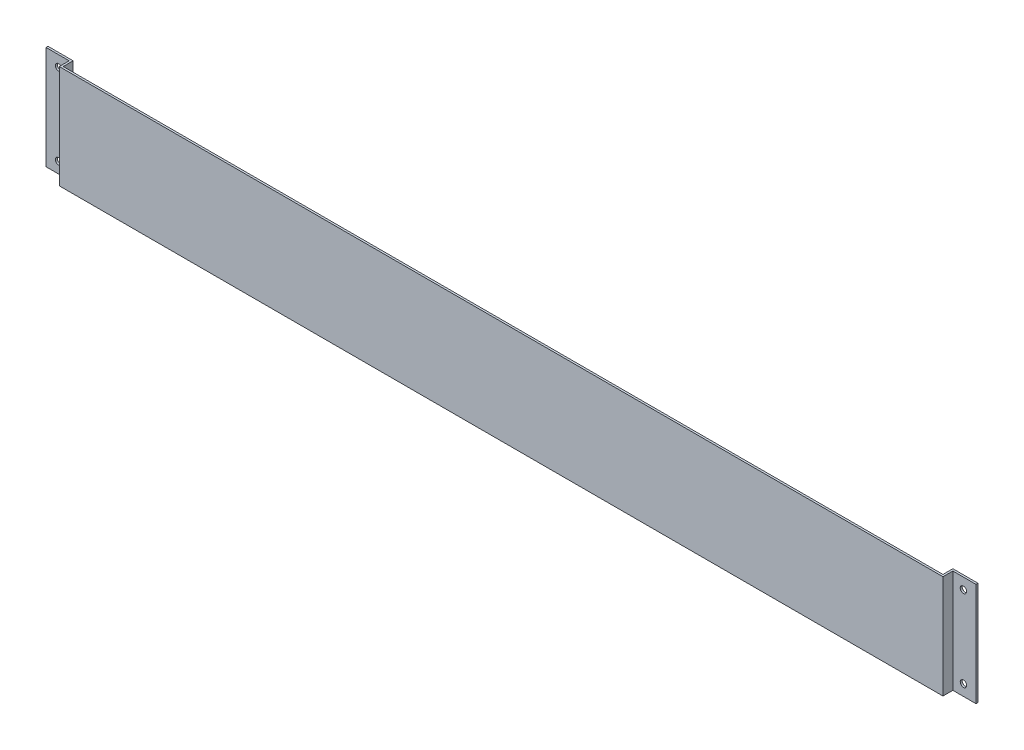
ISO-10303-21;
HEADER;
FILE_DESCRIPTION(('STEP AP214'),'2;1');
FILE_NAME('part.step','',(''),(''),'','','');
FILE_SCHEMA(('AUTOMOTIVE_DESIGN { 1 0 10303 214 1 1 1 1 }'));
ENDSEC;
DATA;
#1=APPLICATION_CONTEXT('core data for automotive mechanical design processes');
#2=APPLICATION_PROTOCOL_DEFINITION('international standard','automotive_design',2000,#1);
#3=PRODUCT_CONTEXT('',#1,'mechanical');
#4=PRODUCT('Part','Part','',(#3));
#5=PRODUCT_RELATED_PRODUCT_CATEGORY('part','',(#4));
#6=PRODUCT_DEFINITION_FORMATION('','',#4);
#7=PRODUCT_DEFINITION_CONTEXT('part definition',#1,'design');
#8=PRODUCT_DEFINITION('design','',#6,#7);
#9=PRODUCT_DEFINITION_SHAPE('','',#8);
#10=(LENGTH_UNIT() NAMED_UNIT(*) SI_UNIT(.MILLI.,.METRE.));
#11=(NAMED_UNIT(*) PLANE_ANGLE_UNIT() SI_UNIT($,.RADIAN.));
#12=(NAMED_UNIT(*) SI_UNIT($,.STERADIAN.) SOLID_ANGLE_UNIT());
#13=UNCERTAINTY_MEASURE_WITH_UNIT(LENGTH_MEASURE(1.E-05),#10,'distance_accuracy_value','');
#14=(GEOMETRIC_REPRESENTATION_CONTEXT(3) GLOBAL_UNCERTAINTY_ASSIGNED_CONTEXT((#13)) GLOBAL_UNIT_ASSIGNED_CONTEXT((#10,
#11,#12)) REPRESENTATION_CONTEXT('',''));
#15=CARTESIAN_POINT('',(0.,0.,0.));
#16=DIRECTION('',(0.,0.,1.));
#17=DIRECTION('',(1.,0.,0.));
#18=AXIS2_PLACEMENT_3D('',#15,#16,#17);
#19=CARTESIAN_POINT('',(914.4,104.45,-42.4689560617034));
#20=DIRECTION('',(0.,0.,1.));
#21=DIRECTION('',(1.,0.,0.));
#22=AXIS2_PLACEMENT_3D('',#19,#20,#21);
#23=PLANE('',#22);
#24=CARTESIAN_POINT('',(927.1,93.34,-42.4689560617034));
#25=DIRECTION('',(0.,0.,1.));
#26=DIRECTION('',(1.,0.,0.));
#27=AXIS2_PLACEMENT_3D('',#24,#25,#26);
#28=CIRCLE('',#27,3.24999999999995);
#29=CARTESIAN_POINT('',(930.35,93.34,-42.4689560617034));
#30=VERTEX_POINT('',#29);
#31=EDGE_CURVE('E267',#30,#30,#28,.T.);
#32=ORIENTED_EDGE('',*,*,#31,.T.);
#33=EDGE_LOOP('',(#32));
#34=FACE_BOUND('',#33,.T.);
#35=CARTESIAN_POINT('',(927.1,11.11,-42.4689560617034));
#36=DIRECTION('',(0.,0.,1.));
#37=DIRECTION('',(1.,0.,0.));
#38=AXIS2_PLACEMENT_3D('',#35,#36,#37);
#39=CIRCLE('',#38,3.24999999999995);
#40=CARTESIAN_POINT('',(930.35,11.11,-42.4689560617034));
#41=VERTEX_POINT('',#40);
#42=EDGE_CURVE('E161',#41,#41,#39,.T.);
#43=ORIENTED_EDGE('',*,*,#42,.T.);
#44=EDGE_LOOP('',(#43));
#45=FACE_BOUND('',#44,.T.);
#46=DIRECTION('',(-1.,0.,0.));
#47=VECTOR('',#46,1.);
#48=CARTESIAN_POINT('',(914.4,0.,-42.4689560617034));
#49=LINE('',#48,#47);
#50=CARTESIAN_POINT('',(939.8,0.,-42.4689560617034));
#51=VERTEX_POINT('',#50);
#52=CARTESIAN_POINT('',(914.4,0.,-42.4689560617034));
#53=VERTEX_POINT('',#52);
#54=EDGE_CURVE('E157',#51,#53,#49,.T.);
#55=ORIENTED_EDGE('',*,*,#54,.T.);
#56=DIRECTION('',(0.,-1.,0.));
#57=VECTOR('',#56,1.);
#58=CARTESIAN_POINT('',(914.4,104.45,-42.4689560617034));
#59=LINE('',#58,#57);
#60=CARTESIAN_POINT('',(914.4,104.45,-42.4689560617034));
#61=VERTEX_POINT('',#60);
#62=EDGE_CURVE('E11',#61,#53,#59,.T.);
#63=ORIENTED_EDGE('',*,*,#62,.F.);
#64=DIRECTION('',(-1.,0.,0.));
#65=VECTOR('',#64,1.);
#66=CARTESIAN_POINT('',(914.4,104.45,-42.4689560617034));
#67=LINE('',#66,#65);
#68=CARTESIAN_POINT('',(939.8,104.45,-42.4689560617034));
#69=VERTEX_POINT('',#68);
#70=EDGE_CURVE('E180',#69,#61,#67,.T.);
#71=ORIENTED_EDGE('',*,*,#70,.F.);
#72=DIRECTION('',(0.,-1.,0.));
#73=VECTOR('',#72,1.);
#74=CARTESIAN_POINT('',(939.8,104.45,-42.4689560617034));
#75=LINE('',#74,#73);
#76=EDGE_CURVE('E153',#69,#51,#75,.T.);
#77=ORIENTED_EDGE('',*,*,#76,.T.);
#78=EDGE_LOOP('',(#55,#63,#71,#77));
#79=FACE_BOUND('',#78,.T.);
#80=ADVANCED_FACE('F37',(#34,#45,#79),#23,.F.);
#81=CARTESIAN_POINT('',(914.4,104.45,-32.4689560617034));
#82=DIRECTION('',(1.,0.,0.));
#83=DIRECTION('',(0.,0.,-1.));
#84=AXIS2_PLACEMENT_3D('',#81,#82,#83);
#85=PLANE('',#84);
#86=DIRECTION('',(0.,0.,1.));
#87=VECTOR('',#86,1.);
#88=CARTESIAN_POINT('',(914.4,0.,-32.4689560617034));
#89=LINE('',#88,#87);
#90=CARTESIAN_POINT('',(914.4,0.,-32.4689560617034));
#91=VERTEX_POINT('',#90);
#92=EDGE_CURVE('E160',#53,#91,#89,.T.);
#93=ORIENTED_EDGE('',*,*,#92,.T.);
#94=DIRECTION('',(0.,-1.,0.));
#95=VECTOR('',#94,1.);
#96=CARTESIAN_POINT('',(914.4,104.45,-32.4689560617034));
#97=LINE('',#96,#95);
#98=CARTESIAN_POINT('',(914.4,104.45,-32.4689560617034));
#99=VERTEX_POINT('',#98);
#100=EDGE_CURVE('E45',#99,#91,#97,.T.);
#101=ORIENTED_EDGE('',*,*,#100,.F.);
#102=DIRECTION('',(0.,0.,1.));
#103=VECTOR('',#102,1.);
#104=CARTESIAN_POINT('',(914.4,104.45,-32.4689560617034));
#105=LINE('',#104,#103);
#106=EDGE_CURVE('E108',#61,#99,#105,.T.);
#107=ORIENTED_EDGE('',*,*,#106,.F.);
#108=ORIENTED_EDGE('',*,*,#62,.T.);
#109=EDGE_LOOP('',(#93,#101,#107,#108));
#110=FACE_BOUND('',#109,.T.);
#111=ADVANCED_FACE('F259',(#110),#85,.F.);
#112=CARTESIAN_POINT('',(25.4,104.45,-32.4689560617034));
#113=DIRECTION('',(0.,0.,1.));
#114=DIRECTION('',(1.,0.,0.));
#115=AXIS2_PLACEMENT_3D('',#112,#113,#114);
#116=PLANE('',#115);
#117=DIRECTION('',(-1.,0.,0.));
#118=VECTOR('',#117,1.);
#119=CARTESIAN_POINT('',(25.4,0.,-32.4689560617034));
#120=LINE('',#119,#118);
#121=CARTESIAN_POINT('',(25.4,0.,-32.4689560617034));
#122=VERTEX_POINT('',#121);
#123=EDGE_CURVE('E163',#91,#122,#120,.T.);
#124=ORIENTED_EDGE('',*,*,#123,.T.);
#125=DIRECTION('',(0.,-1.,0.));
#126=VECTOR('',#125,1.);
#127=CARTESIAN_POINT('',(25.4,104.45,-32.4689560617034));
#128=LINE('',#127,#126);
#129=CARTESIAN_POINT('',(25.4,104.45,-32.4689560617034));
#130=VERTEX_POINT('',#129);
#131=EDGE_CURVE('E199',#130,#122,#128,.T.);
#132=ORIENTED_EDGE('',*,*,#131,.F.);
#133=DIRECTION('',(-1.,0.,0.));
#134=VECTOR('',#133,1.);
#135=CARTESIAN_POINT('',(25.4,104.45,-32.4689560617034));
#136=LINE('',#135,#134);
#137=EDGE_CURVE('E207',#99,#130,#136,.T.);
#138=ORIENTED_EDGE('',*,*,#137,.F.);
#139=ORIENTED_EDGE('',*,*,#100,.T.);
#140=EDGE_LOOP('',(#124,#132,#138,#139));
#141=FACE_BOUND('',#140,.T.);
#142=ADVANCED_FACE('F205',(#141),#116,.F.);
#143=CARTESIAN_POINT('',(25.4,104.45,-42.4689560617034));
#144=DIRECTION('',(-1.,0.,0.));
#145=DIRECTION('',(0.,0.,1.));
#146=AXIS2_PLACEMENT_3D('',#143,#144,#145);
#147=PLANE('',#146);
#148=DIRECTION('',(0.,0.,-1.));
#149=VECTOR('',#148,1.);
#150=CARTESIAN_POINT('',(25.4,0.,-42.4689560617034));
#151=LINE('',#150,#149);
#152=CARTESIAN_POINT('',(25.4,0.,-42.4689560617034));
#153=VERTEX_POINT('',#152);
#154=EDGE_CURVE('E165',#122,#153,#151,.T.);
#155=ORIENTED_EDGE('',*,*,#154,.T.);
#156=DIRECTION('',(0.,-1.,0.));
#157=VECTOR('',#156,1.);
#158=CARTESIAN_POINT('',(25.4,104.45,-42.4689560617034));
#159=LINE('',#158,#157);
#160=CARTESIAN_POINT('',(25.4,104.45,-42.4689560617034));
#161=VERTEX_POINT('',#160);
#162=EDGE_CURVE('E196',#161,#153,#159,.T.);
#163=ORIENTED_EDGE('',*,*,#162,.F.);
#164=DIRECTION('',(0.,0.,-1.));
#165=VECTOR('',#164,1.);
#166=CARTESIAN_POINT('',(25.4,104.45,-42.4689560617034));
#167=LINE('',#166,#165);
#168=EDGE_CURVE('E225',#130,#161,#167,.T.);
#169=ORIENTED_EDGE('',*,*,#168,.F.);
#170=ORIENTED_EDGE('',*,*,#131,.T.);
#171=EDGE_LOOP('',(#155,#163,#169,#170));
#172=FACE_BOUND('',#171,.T.);
#173=ADVANCED_FACE('F216',(#172),#147,.F.);
#174=CARTESIAN_POINT('',(0.,104.45,-42.4689560617034));
#175=DIRECTION('',(0.,0.,1.));
#176=DIRECTION('',(1.,0.,0.));
#177=AXIS2_PLACEMENT_3D('',#174,#175,#176);
#178=PLANE('',#177);
#179=CARTESIAN_POINT('',(12.7,11.11,-42.4689560617034));
#180=DIRECTION('',(0.,0.,1.));
#181=DIRECTION('',(1.,0.,0.));
#182=AXIS2_PLACEMENT_3D('',#179,#180,#181);
#183=CIRCLE('',#182,3.25);
#184=CARTESIAN_POINT('',(15.95,11.11,-42.4689560617034));
#185=VERTEX_POINT('',#184);
#186=EDGE_CURVE('E281',#185,#185,#183,.T.);
#187=ORIENTED_EDGE('',*,*,#186,.T.);
#188=EDGE_LOOP('',(#187));
#189=FACE_BOUND('',#188,.T.);
#190=CARTESIAN_POINT('',(12.7,93.34,-42.4689560617034));
#191=DIRECTION('',(0.,0.,1.));
#192=DIRECTION('',(1.,0.,0.));
#193=AXIS2_PLACEMENT_3D('',#190,#191,#192);
#194=CIRCLE('',#193,3.25);
#195=CARTESIAN_POINT('',(15.95,93.34,-42.4689560617034));
#196=VERTEX_POINT('',#195);
#197=EDGE_CURVE('E282',#196,#196,#194,.T.);
#198=ORIENTED_EDGE('',*,*,#197,.T.);
#199=EDGE_LOOP('',(#198));
#200=FACE_BOUND('',#199,.T.);
#201=DIRECTION('',(-1.,0.,0.));
#202=VECTOR('',#201,1.);
#203=CARTESIAN_POINT('',(0.,0.,-42.4689560617034));
#204=LINE('',#203,#202);
#205=CARTESIAN_POINT('',(0.,0.,-42.4689560617034));
#206=VERTEX_POINT('',#205);
#207=EDGE_CURVE('E167',#153,#206,#204,.T.);
#208=ORIENTED_EDGE('',*,*,#207,.T.);
#209=DIRECTION('',(0.,-1.,0.));
#210=VECTOR('',#209,1.);
#211=CARTESIAN_POINT('',(0.,104.45,-42.4689560617034));
#212=LINE('',#211,#210);
#213=CARTESIAN_POINT('',(0.,104.45,-42.4689560617034));
#214=VERTEX_POINT('',#213);
#215=EDGE_CURVE('E193',#214,#206,#212,.T.);
#216=ORIENTED_EDGE('',*,*,#215,.F.);
#217=DIRECTION('',(-1.,0.,0.));
#218=VECTOR('',#217,1.);
#219=CARTESIAN_POINT('',(0.,104.45,-42.4689560617034));
#220=LINE('',#219,#218);
#221=EDGE_CURVE('E222',#161,#214,#220,.T.);
#222=ORIENTED_EDGE('',*,*,#221,.F.);
#223=ORIENTED_EDGE('',*,*,#162,.T.);
#224=EDGE_LOOP('',(#208,#216,#222,#223));
#225=FACE_BOUND('',#224,.T.);
#226=ADVANCED_FACE('F220',(#189,#200,#225),#178,.F.);
#227=CARTESIAN_POINT('',(0.,104.45,-40.4689560617034));
#228=DIRECTION('',(1.,0.,0.));
#229=DIRECTION('',(0.,0.,-1.));
#230=AXIS2_PLACEMENT_3D('',#227,#228,#229);
#231=PLANE('',#230);
#232=DIRECTION('',(0.,0.,1.));
#233=VECTOR('',#232,1.);
#234=CARTESIAN_POINT('',(0.,0.,-40.4689560617034));
#235=LINE('',#234,#233);
#236=CARTESIAN_POINT('',(0.,0.,-40.4689560617034));
#237=VERTEX_POINT('',#236);
#238=EDGE_CURVE('E169',#206,#237,#235,.T.);
#239=ORIENTED_EDGE('',*,*,#238,.T.);
#240=DIRECTION('',(0.,-1.,0.));
#241=VECTOR('',#240,1.);
#242=CARTESIAN_POINT('',(0.,104.45,-40.4689560617034));
#243=LINE('',#242,#241);
#244=CARTESIAN_POINT('',(0.,104.45,-40.4689560617034));
#245=VERTEX_POINT('',#244);
#246=EDGE_CURVE('E190',#245,#237,#243,.T.);
#247=ORIENTED_EDGE('',*,*,#246,.F.);
#248=DIRECTION('',(0.,0.,1.));
#249=VECTOR('',#248,1.);
#250=CARTESIAN_POINT('',(0.,104.45,-40.4689560617034));
#251=LINE('',#250,#249);
#252=EDGE_CURVE('E224',#214,#245,#251,.T.);
#253=ORIENTED_EDGE('',*,*,#252,.F.);
#254=ORIENTED_EDGE('',*,*,#215,.T.);
#255=EDGE_LOOP('',(#239,#247,#253,#254));
#256=FACE_BOUND('',#255,.T.);
#257=ADVANCED_FACE('F307',(#256),#231,.F.);
#258=CARTESIAN_POINT('',(23.4,104.45,-40.4689560617034));
#259=DIRECTION('',(0.,0.,-1.));
#260=DIRECTION('',(-1.,0.,0.));
#261=AXIS2_PLACEMENT_3D('',#258,#259,#260);
#262=PLANE('',#261);
#263=CARTESIAN_POINT('',(12.7,11.11,-40.4689560617031));
#264=DIRECTION('',(0.,0.,1.));
#265=DIRECTION('',(1.,0.,0.));
#266=AXIS2_PLACEMENT_3D('',#263,#264,#265);
#267=CIRCLE('',#266,3.25);
#268=CARTESIAN_POINT('',(15.95,11.11,-40.4689560617031));
#269=VERTEX_POINT('',#268);
#270=EDGE_CURVE('E276',#269,#269,#267,.T.);
#271=ORIENTED_EDGE('',*,*,#270,.F.);
#272=EDGE_LOOP('',(#271));
#273=FACE_BOUND('',#272,.T.);
#274=CARTESIAN_POINT('',(12.7,93.34,-40.4689560617031));
#275=DIRECTION('',(0.,0.,1.));
#276=DIRECTION('',(1.,0.,0.));
#277=AXIS2_PLACEMENT_3D('',#274,#275,#276);
#278=CIRCLE('',#277,3.25);
#279=CARTESIAN_POINT('',(15.95,93.34,-40.4689560617031));
#280=VERTEX_POINT('',#279);
#281=EDGE_CURVE('E289',#280,#280,#278,.T.);
#282=ORIENTED_EDGE('',*,*,#281,.F.);
#283=EDGE_LOOP('',(#282));
#284=FACE_BOUND('',#283,.T.);
#285=DIRECTION('',(1.,0.,0.));
#286=VECTOR('',#285,1.);
#287=CARTESIAN_POINT('',(23.4,0.,-40.4689560617034));
#288=LINE('',#287,#286);
#289=CARTESIAN_POINT('',(23.4,0.,-40.4689560617034));
#290=VERTEX_POINT('',#289);
#291=EDGE_CURVE('E171',#237,#290,#288,.T.);
#292=ORIENTED_EDGE('',*,*,#291,.T.);
#293=DIRECTION('',(0.,-1.,0.));
#294=VECTOR('',#293,1.);
#295=CARTESIAN_POINT('',(23.4,104.45,-40.4689560617034));
#296=LINE('',#295,#294);
#297=CARTESIAN_POINT('',(23.4,104.45,-40.4689560617034));
#298=VERTEX_POINT('',#297);
#299=EDGE_CURVE('E187',#298,#290,#296,.T.);
#300=ORIENTED_EDGE('',*,*,#299,.F.);
#301=DIRECTION('',(1.,0.,0.));
#302=VECTOR('',#301,1.);
#303=CARTESIAN_POINT('',(23.4,104.45,-40.4689560617034));
#304=LINE('',#303,#302);
#305=EDGE_CURVE('E227',#245,#298,#304,.T.);
#306=ORIENTED_EDGE('',*,*,#305,.F.);
#307=ORIENTED_EDGE('',*,*,#246,.T.);
#308=EDGE_LOOP('',(#292,#300,#306,#307));
#309=FACE_BOUND('',#308,.T.);
#310=ADVANCED_FACE('F304',(#273,#284,#309),#262,.F.);
#311=CARTESIAN_POINT('',(23.4,104.45,-30.4689560617034));
#312=DIRECTION('',(1.,0.,0.));
#313=DIRECTION('',(0.,0.,-1.));
#314=AXIS2_PLACEMENT_3D('',#311,#312,#313);
#315=PLANE('',#314);
#316=DIRECTION('',(0.,0.,1.));
#317=VECTOR('',#316,1.);
#318=CARTESIAN_POINT('',(23.4,0.,-30.4689560617034));
#319=LINE('',#318,#317);
#320=CARTESIAN_POINT('',(23.4,0.,-30.4689560617034));
#321=VERTEX_POINT('',#320);
#322=EDGE_CURVE('E173',#290,#321,#319,.T.);
#323=ORIENTED_EDGE('',*,*,#322,.T.);
#324=DIRECTION('',(0.,-1.,0.));
#325=VECTOR('',#324,1.);
#326=CARTESIAN_POINT('',(23.4,104.45,-30.4689560617034));
#327=LINE('',#326,#325);
#328=CARTESIAN_POINT('',(23.4,104.45,-30.4689560617034));
#329=VERTEX_POINT('',#328);
#330=EDGE_CURVE('E184',#329,#321,#327,.T.);
#331=ORIENTED_EDGE('',*,*,#330,.F.);
#332=DIRECTION('',(0.,0.,1.));
#333=VECTOR('',#332,1.);
#334=CARTESIAN_POINT('',(23.4,104.45,-30.4689560617034));
#335=LINE('',#334,#333);
#336=EDGE_CURVE('E233',#298,#329,#335,.T.);
#337=ORIENTED_EDGE('',*,*,#336,.F.);
#338=ORIENTED_EDGE('',*,*,#299,.T.);
#339=EDGE_LOOP('',(#323,#331,#337,#338));
#340=FACE_BOUND('',#339,.T.);
#341=ADVANCED_FACE('F239',(#340),#315,.F.);
#342=CARTESIAN_POINT('',(916.4,104.45,-30.4689560617036));
#343=DIRECTION('',(0.,0.,-1.));
#344=DIRECTION('',(-1.,0.,0.));
#345=AXIS2_PLACEMENT_3D('',#342,#343,#344);
#346=PLANE('',#345);
#347=DIRECTION('',(1.,0.,0.));
#348=VECTOR('',#347,1.);
#349=CARTESIAN_POINT('',(916.4,0.,-30.4689560617036));
#350=LINE('',#349,#348);
#351=CARTESIAN_POINT('',(916.4,0.,-30.4689560617036));
#352=VERTEX_POINT('',#351);
#353=EDGE_CURVE('E175',#321,#352,#350,.T.);
#354=ORIENTED_EDGE('',*,*,#353,.T.);
#355=DIRECTION('',(0.,-1.,0.));
#356=VECTOR('',#355,1.);
#357=CARTESIAN_POINT('',(916.4,104.45,-30.4689560617036));
#358=LINE('',#357,#356);
#359=CARTESIAN_POINT('',(916.4,104.45,-30.4689560617036));
#360=VERTEX_POINT('',#359);
#361=EDGE_CURVE('E148',#360,#352,#358,.T.);
#362=ORIENTED_EDGE('',*,*,#361,.F.);
#363=DIRECTION('',(1.,0.,0.));
#364=VECTOR('',#363,1.);
#365=CARTESIAN_POINT('',(916.4,104.45,-30.4689560617036));
#366=LINE('',#365,#364);
#367=EDGE_CURVE('E139',#329,#360,#366,.T.);
#368=ORIENTED_EDGE('',*,*,#367,.F.);
#369=ORIENTED_EDGE('',*,*,#330,.T.);
#370=EDGE_LOOP('',(#354,#362,#368,#369));
#371=FACE_BOUND('',#370,.T.);
#372=ADVANCED_FACE('F243',(#371),#346,.F.);
#373=CARTESIAN_POINT('',(916.4,104.45,-40.4689560617034));
#374=DIRECTION('',(-1.,0.,0.));
#375=DIRECTION('',(0.,0.,1.));
#376=AXIS2_PLACEMENT_3D('',#373,#374,#375);
#377=PLANE('',#376);
#378=DIRECTION('',(0.,0.,-1.));
#379=VECTOR('',#378,1.);
#380=CARTESIAN_POINT('',(916.4,0.,-40.4689560617034));
#381=LINE('',#380,#379);
#382=CARTESIAN_POINT('',(916.4,0.,-40.4689560617034));
#383=VERTEX_POINT('',#382);
#384=EDGE_CURVE('E147',#352,#383,#381,.T.);
#385=ORIENTED_EDGE('',*,*,#384,.T.);
#386=DIRECTION('',(0.,-1.,0.));
#387=VECTOR('',#386,1.);
#388=CARTESIAN_POINT('',(916.4,104.45,-40.4689560617034));
#389=LINE('',#388,#387);
#390=CARTESIAN_POINT('',(916.4,104.45,-40.4689560617034));
#391=VERTEX_POINT('',#390);
#392=EDGE_CURVE('E144',#391,#383,#389,.T.);
#393=ORIENTED_EDGE('',*,*,#392,.F.);
#394=DIRECTION('',(0.,0.,-1.));
#395=VECTOR('',#394,1.);
#396=CARTESIAN_POINT('',(916.4,104.45,-40.4689560617034));
#397=LINE('',#396,#395);
#398=EDGE_CURVE('E133',#360,#391,#397,.T.);
#399=ORIENTED_EDGE('',*,*,#398,.F.);
#400=ORIENTED_EDGE('',*,*,#361,.T.);
#401=EDGE_LOOP('',(#385,#393,#399,#400));
#402=FACE_BOUND('',#401,.T.);
#403=ADVANCED_FACE('F145',(#402),#377,.F.);
#404=CARTESIAN_POINT('',(939.8,104.45,-40.4689560617034));
#405=DIRECTION('',(0.,0.,-1.));
#406=DIRECTION('',(-1.,0.,0.));
#407=AXIS2_PLACEMENT_3D('',#404,#405,#406);
#408=PLANE('',#407);
#409=CARTESIAN_POINT('',(927.1,93.34,-40.4689560617031));
#410=DIRECTION('',(0.,0.,1.));
#411=DIRECTION('',(1.,0.,0.));
#412=AXIS2_PLACEMENT_3D('',#409,#410,#411);
#413=CIRCLE('',#412,3.24999999999995);
#414=CARTESIAN_POINT('',(930.35,93.34,-40.4689560617031));
#415=VERTEX_POINT('',#414);
#416=EDGE_CURVE('E285',#415,#415,#413,.T.);
#417=ORIENTED_EDGE('',*,*,#416,.F.);
#418=EDGE_LOOP('',(#417));
#419=FACE_BOUND('',#418,.T.);
#420=CARTESIAN_POINT('',(927.1,11.11,-40.4689560617031));
#421=DIRECTION('',(0.,0.,1.));
#422=DIRECTION('',(1.,0.,0.));
#423=AXIS2_PLACEMENT_3D('',#420,#421,#422);
#424=CIRCLE('',#423,3.24999999999995);
#425=CARTESIAN_POINT('',(930.35,11.11,-40.4689560617031));
#426=VERTEX_POINT('',#425);
#427=EDGE_CURVE('E271',#426,#426,#424,.T.);
#428=ORIENTED_EDGE('',*,*,#427,.F.);
#429=EDGE_LOOP('',(#428));
#430=FACE_BOUND('',#429,.T.);
#431=DIRECTION('',(1.,0.,0.));
#432=VECTOR('',#431,1.);
#433=CARTESIAN_POINT('',(939.8,0.,-40.4689560617034));
#434=LINE('',#433,#432);
#435=CARTESIAN_POINT('',(939.8,0.,-40.4689560617034));
#436=VERTEX_POINT('',#435);
#437=EDGE_CURVE('E94',#383,#436,#434,.T.);
#438=ORIENTED_EDGE('',*,*,#437,.T.);
#439=DIRECTION('',(0.,-1.,0.));
#440=VECTOR('',#439,1.);
#441=CARTESIAN_POINT('',(939.8,104.45,-40.4689560617034));
#442=LINE('',#441,#440);
#443=CARTESIAN_POINT('',(939.8,104.45,-40.4689560617034));
#444=VERTEX_POINT('',#443);
#445=EDGE_CURVE('E149',#444,#436,#442,.T.);
#446=ORIENTED_EDGE('',*,*,#445,.F.);
#447=DIRECTION('',(1.,0.,0.));
#448=VECTOR('',#447,1.);
#449=CARTESIAN_POINT('',(939.8,104.45,-40.4689560617034));
#450=LINE('',#449,#448);
#451=EDGE_CURVE('E137',#391,#444,#450,.T.);
#452=ORIENTED_EDGE('',*,*,#451,.F.);
#453=ORIENTED_EDGE('',*,*,#392,.T.);
#454=EDGE_LOOP('',(#438,#446,#452,#453));
#455=FACE_BOUND('',#454,.T.);
#456=ADVANCED_FACE('F151',(#419,#430,#455),#408,.F.);
#457=CARTESIAN_POINT('',(939.8,104.45,-42.4689560617034));
#458=DIRECTION('',(-1.,0.,0.));
#459=DIRECTION('',(0.,0.,1.));
#460=AXIS2_PLACEMENT_3D('',#457,#458,#459);
#461=PLANE('',#460);
#462=DIRECTION('',(0.,0.,-1.));
#463=VECTOR('',#462,1.);
#464=CARTESIAN_POINT('',(939.8,0.,-42.4689560617034));
#465=LINE('',#464,#463);
#466=EDGE_CURVE('E100',#436,#51,#465,.T.);
#467=ORIENTED_EDGE('',*,*,#466,.T.);
#468=ORIENTED_EDGE('',*,*,#76,.F.);
#469=DIRECTION('',(0.,0.,-1.));
#470=VECTOR('',#469,1.);
#471=CARTESIAN_POINT('',(939.8,104.45,-42.4689560617034));
#472=LINE('',#471,#470);
#473=EDGE_CURVE('E53',#444,#69,#472,.T.);
#474=ORIENTED_EDGE('',*,*,#473,.F.);
#475=ORIENTED_EDGE('',*,*,#445,.T.);
#476=EDGE_LOOP('',(#467,#468,#474,#475));
#477=FACE_BOUND('',#476,.T.);
#478=ADVANCED_FACE('F247',(#477),#461,.F.);
#479=CARTESIAN_POINT('',(0.,104.45,0.));
#480=DIRECTION('',(0.,-1.,0.));
#481=DIRECTION('',(0.,0.,-1.));
#482=AXIS2_PLACEMENT_3D('',#479,#480,#481);
#483=PLANE('',#482);
#484=ORIENTED_EDGE('',*,*,#70,.T.);
#485=ORIENTED_EDGE('',*,*,#106,.T.);
#486=ORIENTED_EDGE('',*,*,#137,.T.);
#487=ORIENTED_EDGE('',*,*,#168,.T.);
#488=ORIENTED_EDGE('',*,*,#221,.T.);
#489=ORIENTED_EDGE('',*,*,#252,.T.);
#490=ORIENTED_EDGE('',*,*,#305,.T.);
#491=ORIENTED_EDGE('',*,*,#336,.T.);
#492=ORIENTED_EDGE('',*,*,#367,.T.);
#493=ORIENTED_EDGE('',*,*,#398,.T.);
#494=ORIENTED_EDGE('',*,*,#451,.T.);
#495=ORIENTED_EDGE('',*,*,#473,.T.);
#496=EDGE_LOOP('',(#484,#485,#486,#487,#488,#489,#490,#491,#492,#493,#494,#495));
#497=FACE_BOUND('',#496,.T.);
#498=ADVANCED_FACE('F135',(#497),#483,.F.);
#499=CARTESIAN_POINT('',(0.,0.,0.));
#500=DIRECTION('',(0.,-1.,0.));
#501=DIRECTION('',(0.,0.,-1.));
#502=AXIS2_PLACEMENT_3D('',#499,#500,#501);
#503=PLANE('',#502);
#504=ORIENTED_EDGE('',*,*,#54,.F.);
#505=ORIENTED_EDGE('',*,*,#466,.F.);
#506=ORIENTED_EDGE('',*,*,#437,.F.);
#507=ORIENTED_EDGE('',*,*,#384,.F.);
#508=ORIENTED_EDGE('',*,*,#353,.F.);
#509=ORIENTED_EDGE('',*,*,#322,.F.);
#510=ORIENTED_EDGE('',*,*,#291,.F.);
#511=ORIENTED_EDGE('',*,*,#238,.F.);
#512=ORIENTED_EDGE('',*,*,#207,.F.);
#513=ORIENTED_EDGE('',*,*,#154,.F.);
#514=ORIENTED_EDGE('',*,*,#123,.F.);
#515=ORIENTED_EDGE('',*,*,#92,.F.);
#516=EDGE_LOOP('',(#504,#505,#506,#507,#508,#509,#510,#511,#512,#513,#514,#515));
#517=FACE_BOUND('',#516,.T.);
#518=ADVANCED_FACE('F211',(#517),#503,.T.);
#519=CARTESIAN_POINT('',(927.1,11.11,-42.4689560617034));
#520=DIRECTION('',(0.,0.,1.));
#521=DIRECTION('',(1.,0.,0.));
#522=AXIS2_PLACEMENT_3D('',#519,#520,#521);
#523=CYLINDRICAL_SURFACE('',#522,3.24999999999995);
#524=ORIENTED_EDGE('',*,*,#42,.F.);
#525=EDGE_LOOP('',(#524));
#526=FACE_BOUND('',#525,.T.);
#527=ORIENTED_EDGE('',*,*,#427,.T.);
#528=EDGE_LOOP('',(#527));
#529=FACE_BOUND('',#528,.T.);
#530=ADVANCED_FACE('F363',(#526,#529),#523,.F.);
#531=CARTESIAN_POINT('',(927.1,93.34,-42.4689560617034));
#532=DIRECTION('',(0.,0.,1.));
#533=DIRECTION('',(1.,0.,0.));
#534=AXIS2_PLACEMENT_3D('',#531,#532,#533);
#535=CYLINDRICAL_SURFACE('',#534,3.24999999999995);
#536=ORIENTED_EDGE('',*,*,#31,.F.);
#537=EDGE_LOOP('',(#536));
#538=FACE_BOUND('',#537,.T.);
#539=ORIENTED_EDGE('',*,*,#416,.T.);
#540=EDGE_LOOP('',(#539));
#541=FACE_BOUND('',#540,.T.);
#542=ADVANCED_FACE('F300',(#538,#541),#535,.F.);
#543=CARTESIAN_POINT('',(12.7,93.34,-42.4689560617034));
#544=DIRECTION('',(0.,0.,1.));
#545=DIRECTION('',(1.,0.,0.));
#546=AXIS2_PLACEMENT_3D('',#543,#544,#545);
#547=CYLINDRICAL_SURFACE('',#546,3.25);
#548=ORIENTED_EDGE('',*,*,#197,.F.);
#549=EDGE_LOOP('',(#548));
#550=FACE_BOUND('',#549,.T.);
#551=ORIENTED_EDGE('',*,*,#281,.T.);
#552=EDGE_LOOP('',(#551));
#553=FACE_BOUND('',#552,.T.);
#554=ADVANCED_FACE('F296',(#550,#553),#547,.F.);
#555=CARTESIAN_POINT('',(12.7,11.11,-42.4689560617034));
#556=DIRECTION('',(0.,0.,1.));
#557=DIRECTION('',(1.,0.,0.));
#558=AXIS2_PLACEMENT_3D('',#555,#556,#557);
#559=CYLINDRICAL_SURFACE('',#558,3.25);
#560=ORIENTED_EDGE('',*,*,#186,.F.);
#561=EDGE_LOOP('',(#560));
#562=FACE_BOUND('',#561,.T.);
#563=ORIENTED_EDGE('',*,*,#270,.T.);
#564=EDGE_LOOP('',(#563));
#565=FACE_BOUND('',#564,.T.);
#566=ADVANCED_FACE('F299',(#562,#565),#559,.F.);
#567=CLOSED_SHELL('',(#80,#111,#142,#173,#226,#257,#310,#341,#372,#403,#456,#478,#498,#518,#530,
#542,#554,#566));
#568=MANIFOLD_SOLID_BREP('B2',#567);
#569=ADVANCED_BREP_SHAPE_REPRESENTATION('',(#18,#568),#14);
#570=SHAPE_DEFINITION_REPRESENTATION(#9,#569);
ENDSEC;
END-ISO-10303-21;
